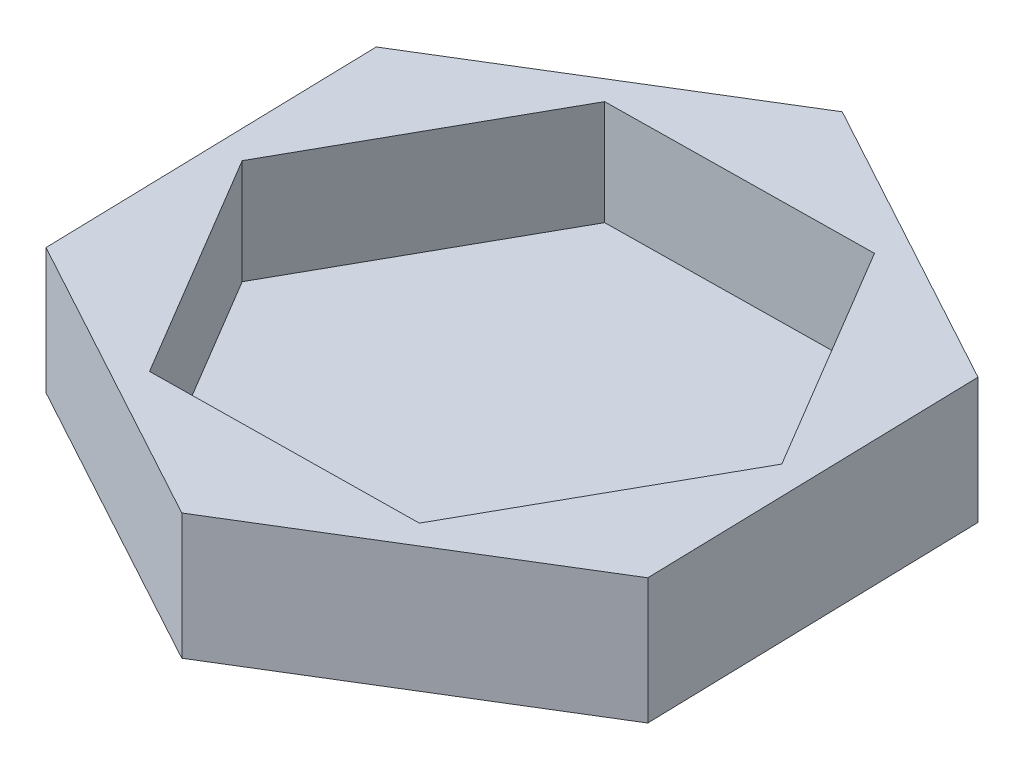
ISO-10303-21;
HEADER;
FILE_DESCRIPTION(('STEP AP214'),'2;1');
FILE_NAME('part.step','',(''),(''),'','','');
FILE_SCHEMA(('AUTOMOTIVE_DESIGN { 1 0 10303 214 1 1 1 1 }'));
ENDSEC;
DATA;
#1=APPLICATION_CONTEXT('core data for automotive mechanical design processes');
#2=APPLICATION_PROTOCOL_DEFINITION('international standard','automotive_design',2000,#1);
#3=PRODUCT_CONTEXT('',#1,'mechanical');
#4=PRODUCT('Part','Part','',(#3));
#5=PRODUCT_RELATED_PRODUCT_CATEGORY('part','',(#4));
#6=PRODUCT_DEFINITION_FORMATION('','',#4);
#7=PRODUCT_DEFINITION_CONTEXT('part definition',#1,'design');
#8=PRODUCT_DEFINITION('design','',#6,#7);
#9=PRODUCT_DEFINITION_SHAPE('','',#8);
#10=(LENGTH_UNIT() NAMED_UNIT(*) SI_UNIT(.MILLI.,.METRE.));
#11=(NAMED_UNIT(*) PLANE_ANGLE_UNIT() SI_UNIT($,.RADIAN.));
#12=(NAMED_UNIT(*) SI_UNIT($,.STERADIAN.) SOLID_ANGLE_UNIT());
#13=UNCERTAINTY_MEASURE_WITH_UNIT(LENGTH_MEASURE(1.E-05),#10,'distance_accuracy_value','');
#14=(GEOMETRIC_REPRESENTATION_CONTEXT(3) GLOBAL_UNCERTAINTY_ASSIGNED_CONTEXT((#13)) GLOBAL_UNIT_ASSIGNED_CONTEXT((#10,
#11,#12)) REPRESENTATION_CONTEXT('',''));
#15=CARTESIAN_POINT('',(0.,0.,0.));
#16=DIRECTION('',(0.,0.,1.));
#17=DIRECTION('',(1.,0.,0.));
#18=AXIS2_PLACEMENT_3D('',#15,#16,#17);
#19=CARTESIAN_POINT('',(-2.05317565383685,30.,-80.8029566480573));
#20=DIRECTION('',(0.521836975991897,0.,0.853045233553082));
#21=DIRECTION('',(0.853045233553082,0.,-0.521836975991897));
#22=AXIS2_PLACEMENT_3D('',#19,#20,#21);
#23=PLANE('',#22);
#24=DIRECTION('',(-0.853045233553082,0.,0.521836975991897));
#25=VECTOR('',#24,1.);
#26=CARTESIAN_POINT('',(-2.05317565383685,0.,-80.8029566480573));
#27=LINE('',#26,#25);
#28=CARTESIAN_POINT('',(-2.05317565383685,0.,-80.8029566480573));
#29=VERTEX_POINT('',#28);
#30=CARTESIAN_POINT('',(-71.0040009850288,0.,-38.6233760493742));
#31=VERTEX_POINT('',#30);
#32=EDGE_CURVE('E146',#29,#31,#27,.T.);
#33=ORIENTED_EDGE('',*,*,#32,.T.);
#34=DIRECTION('',(0.,-1.,0.));
#35=VECTOR('',#34,1.);
#36=CARTESIAN_POINT('',(-71.0040009850288,30.,-38.6233760493742));
#37=LINE('',#36,#35);
#38=CARTESIAN_POINT('',(-71.0040009850288,30.,-38.6233760493742));
#39=VERTEX_POINT('',#38);
#40=EDGE_CURVE('E11',#39,#31,#37,.T.);
#41=ORIENTED_EDGE('',*,*,#40,.F.);
#42=DIRECTION('',(-0.853045233553082,0.,0.521836975991897));
#43=VECTOR('',#42,1.);
#44=CARTESIAN_POINT('',(-2.05317565383685,30.,-80.8029566480573));
#45=LINE('',#44,#43);
#46=CARTESIAN_POINT('',(-2.05317565383685,30.,-80.8029566480573));
#47=VERTEX_POINT('',#46);
#48=EDGE_CURVE('E164',#47,#39,#45,.T.);
#49=ORIENTED_EDGE('',*,*,#48,.F.);
#50=DIRECTION('',(0.,-1.,0.));
#51=VECTOR('',#50,1.);
#52=CARTESIAN_POINT('',(-2.05317565383685,30.,-80.8029566480573));
#53=LINE('',#52,#51);
#54=EDGE_CURVE('E142',#47,#29,#53,.T.);
#55=ORIENTED_EDGE('',*,*,#54,.T.);
#56=EDGE_LOOP('',(#33,#41,#49,#55));
#57=FACE_BOUND('',#56,.T.);
#58=ADVANCED_FACE('F45',(#57),#23,.F.);
#59=CARTESIAN_POINT('',(-71.0040009850288,30.,-38.6233760493742));
#60=DIRECTION('',(0.999677330830147,0.,-0.0254014610664925));
#61=DIRECTION('',(-0.0254014610664925,0.,-0.999677330830147));
#62=AXIS2_PLACEMENT_3D('',#59,#60,#61);
#63=PLANE('',#62);
#64=DIRECTION('',(0.0254014610664925,0.,0.999677330830147));
#65=VECTOR('',#64,1.);
#66=CARTESIAN_POINT('',(-71.0040009850288,0.,-38.6233760493742));
#67=LINE('',#66,#65);
#68=CARTESIAN_POINT('',(-68.9508253311919,0.,42.1795805986831));
#69=VERTEX_POINT('',#68);
#70=EDGE_CURVE('E150',#31,#69,#67,.T.);
#71=ORIENTED_EDGE('',*,*,#70,.T.);
#72=DIRECTION('',(0.,-1.,0.));
#73=VECTOR('',#72,1.);
#74=CARTESIAN_POINT('',(-68.9508253311919,30.,42.1795805986831));
#75=LINE('',#74,#73);
#76=CARTESIAN_POINT('',(-68.9508253311919,30.,42.1795805986831));
#77=VERTEX_POINT('',#76);
#78=EDGE_CURVE('E53',#77,#69,#75,.T.);
#79=ORIENTED_EDGE('',*,*,#78,.F.);
#80=DIRECTION('',(0.0254014610664925,0.,0.999677330830147));
#81=VECTOR('',#80,1.);
#82=CARTESIAN_POINT('',(-71.0040009850288,30.,-38.6233760493742));
#83=LINE('',#82,#81);
#84=EDGE_CURVE('E104',#39,#77,#83,.T.);
#85=ORIENTED_EDGE('',*,*,#84,.F.);
#86=ORIENTED_EDGE('',*,*,#40,.T.);
#87=EDGE_LOOP('',(#71,#79,#85,#86));
#88=FACE_BOUND('',#87,.T.);
#89=ADVANCED_FACE('F311',(#88),#63,.F.);
#90=CARTESIAN_POINT('',(-68.9508253311919,30.,42.1795805986831));
#91=DIRECTION('',(0.47784035483825,0.,-0.878446694619574));
#92=DIRECTION('',(-0.878446694619574,0.,-0.47784035483825));
#93=AXIS2_PLACEMENT_3D('',#90,#91,#92);
#94=PLANE('',#93);
#95=DIRECTION('',(0.878446694619574,0.,0.47784035483825));
#96=VECTOR('',#95,1.);
#97=CARTESIAN_POINT('',(-68.9508253311919,0.,42.1795805986831));
#98=LINE('',#97,#96);
#99=CARTESIAN_POINT('',(2.05317565383684,0.,80.8029566480573));
#100=VERTEX_POINT('',#99);
#101=EDGE_CURVE('E154',#69,#100,#98,.T.);
#102=ORIENTED_EDGE('',*,*,#101,.T.);
#103=DIRECTION('',(0.,-1.,0.));
#104=VECTOR('',#103,1.);
#105=CARTESIAN_POINT('',(2.05317565383684,30.,80.8029566480573));
#106=LINE('',#105,#104);
#107=CARTESIAN_POINT('',(2.05317565383684,30.,80.8029566480573));
#108=VERTEX_POINT('',#107);
#109=EDGE_CURVE('E135',#108,#100,#106,.T.);
#110=ORIENTED_EDGE('',*,*,#109,.F.);
#111=DIRECTION('',(0.878446694619574,0.,0.47784035483825));
#112=VECTOR('',#111,1.);
#113=CARTESIAN_POINT('',(-68.9508253311919,30.,42.1795805986831));
#114=LINE('',#113,#112);
#115=EDGE_CURVE('E121',#77,#108,#114,.T.);
#116=ORIENTED_EDGE('',*,*,#115,.F.);
#117=ORIENTED_EDGE('',*,*,#78,.T.);
#118=EDGE_LOOP('',(#102,#110,#116,#117));
#119=FACE_BOUND('',#118,.T.);
#120=ADVANCED_FACE('F174',(#119),#94,.F.);
#121=CARTESIAN_POINT('',(2.05317565383684,30.,80.8029566480573));
#122=DIRECTION('',(-0.521836975991898,0.,-0.853045233553082));
#123=DIRECTION('',(-0.853045233553082,0.,0.521836975991898));
#124=AXIS2_PLACEMENT_3D('',#121,#122,#123);
#125=PLANE('',#124);
#126=DIRECTION('',(0.853045233553082,0.,-0.521836975991898));
#127=VECTOR('',#126,1.);
#128=CARTESIAN_POINT('',(2.05317565383684,0.,80.8029566480573));
#129=LINE('',#128,#127);
#130=CARTESIAN_POINT('',(71.0040009850287,0.,38.6233760493741));
#131=VERTEX_POINT('',#130);
#132=EDGE_CURVE('E131',#100,#131,#129,.T.);
#133=ORIENTED_EDGE('',*,*,#132,.T.);
#134=DIRECTION('',(0.,-1.,0.));
#135=VECTOR('',#134,1.);
#136=CARTESIAN_POINT('',(71.0040009850287,30.,38.6233760493741));
#137=LINE('',#136,#135);
#138=CARTESIAN_POINT('',(71.0040009850287,30.,38.6233760493741));
#139=VERTEX_POINT('',#138);
#140=EDGE_CURVE('E128',#139,#131,#137,.T.);
#141=ORIENTED_EDGE('',*,*,#140,.F.);
#142=DIRECTION('',(0.853045233553082,0.,-0.521836975991898));
#143=VECTOR('',#142,1.);
#144=CARTESIAN_POINT('',(2.05317565383684,30.,80.8029566480573));
#145=LINE('',#144,#143);
#146=EDGE_CURVE('E114',#108,#139,#145,.T.);
#147=ORIENTED_EDGE('',*,*,#146,.F.);
#148=ORIENTED_EDGE('',*,*,#109,.T.);
#149=EDGE_LOOP('',(#133,#141,#147,#148));
#150=FACE_BOUND('',#149,.T.);
#151=ADVANCED_FACE('F129',(#150),#125,.F.);
#152=CARTESIAN_POINT('',(71.0040009850287,30.,38.6233760493741));
#153=DIRECTION('',(-0.999677330830147,0.,0.0254014610664925));
#154=DIRECTION('',(0.0254014610664925,0.,0.999677330830147));
#155=AXIS2_PLACEMENT_3D('',#152,#153,#154);
#156=PLANE('',#155);
#157=DIRECTION('',(-0.0254014610664925,0.,-0.999677330830147));
#158=VECTOR('',#157,1.);
#159=CARTESIAN_POINT('',(71.0040009850287,0.,38.6233760493741));
#160=LINE('',#159,#158);
#161=CARTESIAN_POINT('',(68.9508253311918,0.,-42.1795805986832));
#162=VERTEX_POINT('',#161);
#163=EDGE_CURVE('E159',#131,#162,#160,.T.);
#164=ORIENTED_EDGE('',*,*,#163,.T.);
#165=DIRECTION('',(0.,-1.,0.));
#166=VECTOR('',#165,1.);
#167=CARTESIAN_POINT('',(68.9508253311918,30.,-42.1795805986832));
#168=LINE('',#167,#166);
#169=CARTESIAN_POINT('',(68.9508253311918,30.,-42.1795805986832));
#170=VERTEX_POINT('',#169);
#171=EDGE_CURVE('E136',#170,#162,#168,.T.);
#172=ORIENTED_EDGE('',*,*,#171,.F.);
#173=DIRECTION('',(-0.0254014610664925,0.,-0.999677330830147));
#174=VECTOR('',#173,1.);
#175=CARTESIAN_POINT('',(71.0040009850287,30.,38.6233760493741));
#176=LINE('',#175,#174);
#177=EDGE_CURVE('E118',#139,#170,#176,.T.);
#178=ORIENTED_EDGE('',*,*,#177,.F.);
#179=ORIENTED_EDGE('',*,*,#140,.T.);
#180=EDGE_LOOP('',(#164,#172,#178,#179));
#181=FACE_BOUND('',#180,.T.);
#182=ADVANCED_FACE('F138',(#181),#156,.F.);
#183=CARTESIAN_POINT('',(68.9508253311918,30.,-42.1795805986832));
#184=DIRECTION('',(-0.47784035483825,0.,0.878446694619574));
#185=DIRECTION('',(0.878446694619574,0.,0.47784035483825));
#186=AXIS2_PLACEMENT_3D('',#183,#184,#185);
#187=PLANE('',#186);
#188=DIRECTION('',(-0.878446694619574,0.,-0.47784035483825));
#189=VECTOR('',#188,1.);
#190=CARTESIAN_POINT('',(68.9508253311918,0.,-42.1795805986832));
#191=LINE('',#190,#189);
#192=EDGE_CURVE('E96',#162,#29,#191,.T.);
#193=ORIENTED_EDGE('',*,*,#192,.T.);
#194=ORIENTED_EDGE('',*,*,#54,.F.);
#195=DIRECTION('',(-0.878446694619574,0.,-0.47784035483825));
#196=VECTOR('',#195,1.);
#197=CARTESIAN_POINT('',(68.9508253311918,30.,-42.1795805986832));
#198=LINE('',#197,#196);
#199=EDGE_CURVE('E69',#170,#47,#198,.T.);
#200=ORIENTED_EDGE('',*,*,#199,.F.);
#201=ORIENTED_EDGE('',*,*,#171,.T.);
#202=EDGE_LOOP('',(#193,#194,#200,#201));
#203=FACE_BOUND('',#202,.T.);
#204=ADVANCED_FACE('F178',(#203),#187,.F.);
#205=CARTESIAN_POINT('',(0.,30.,0.));
#206=DIRECTION('',(0.,1.,0.));
#207=DIRECTION('',(0.,0.,1.));
#208=AXIS2_PLACEMENT_3D('',#205,#206,#207);
#209=PLANE('',#208);
#210=DIRECTION('',(-0.999912596267652,0.,0.0132211884973553));
#211=VECTOR('',#210,1.);
#212=CARTESIAN_POINT('',(31.0243239968129,30.,-55.4150219153084));
#213=LINE('',#212,#211);
#214=CARTESIAN_POINT('',(31.0243239968129,30.,-55.4150219153084));
#215=VERTEX_POINT('',#214);
#216=CARTESIAN_POINT('',(-32.478654731522,30.,-54.5753636741334));
#217=VERTEX_POINT('',#216);
#218=EDGE_CURVE('E60',#215,#217,#213,.T.);
#219=ORIENTED_EDGE('',*,*,#218,.F.);
#220=DIRECTION('',(-0.511406183240759,0.,-0.859339115683162));
#221=VECTOR('',#220,1.);
#222=CARTESIAN_POINT('',(63.502978728335,30.,-0.839658241175054));
#223=LINE('',#222,#221);
#224=CARTESIAN_POINT('',(63.502978728335,30.,-0.839658241175054));
#225=VERTEX_POINT('',#224);
#226=EDGE_CURVE('E210',#225,#215,#223,.T.);
#227=ORIENTED_EDGE('',*,*,#226,.F.);
#228=DIRECTION('',(0.488506413026894,0.,-0.872560304180518));
#229=VECTOR('',#228,1.);
#230=CARTESIAN_POINT('',(32.478654731522,30.,54.5753636741334));
#231=LINE('',#230,#229);
#232=CARTESIAN_POINT('',(32.478654731522,30.,54.5753636741334));
#233=VERTEX_POINT('',#232);
#234=EDGE_CURVE('E215',#233,#225,#231,.T.);
#235=ORIENTED_EDGE('',*,*,#234,.F.);
#236=DIRECTION('',(0.999912596267652,0.,-0.0132211884973553));
#237=VECTOR('',#236,1.);
#238=CARTESIAN_POINT('',(-31.0243239968129,30.,55.4150219153084));
#239=LINE('',#238,#237);
#240=CARTESIAN_POINT('',(-31.0243239968129,30.,55.4150219153084));
#241=VERTEX_POINT('',#240);
#242=EDGE_CURVE('E219',#241,#233,#239,.T.);
#243=ORIENTED_EDGE('',*,*,#242,.F.);
#244=DIRECTION('',(0.511406183240759,0.,0.859339115683162));
#245=VECTOR('',#244,1.);
#246=CARTESIAN_POINT('',(-63.5029787283349,30.,0.839658241175057));
#247=LINE('',#246,#245);
#248=CARTESIAN_POINT('',(-63.5029787283349,30.,0.839658241175057));
#249=VERTEX_POINT('',#248);
#250=EDGE_CURVE('E223',#249,#241,#247,.T.);
#251=ORIENTED_EDGE('',*,*,#250,.F.);
#252=DIRECTION('',(-0.488506413026894,0.,0.872560304180518));
#253=VECTOR('',#252,1.);
#254=CARTESIAN_POINT('',(-32.478654731522,30.,-54.5753636741334));
#255=LINE('',#254,#253);
#256=EDGE_CURVE('E227',#217,#249,#255,.T.);
#257=ORIENTED_EDGE('',*,*,#256,.F.);
#258=EDGE_LOOP('',(#219,#227,#235,#243,#251,#257));
#259=FACE_BOUND('',#258,.T.);
#260=ORIENTED_EDGE('',*,*,#48,.T.);
#261=ORIENTED_EDGE('',*,*,#84,.T.);
#262=ORIENTED_EDGE('',*,*,#115,.T.);
#263=ORIENTED_EDGE('',*,*,#146,.T.);
#264=ORIENTED_EDGE('',*,*,#177,.T.);
#265=ORIENTED_EDGE('',*,*,#199,.T.);
#266=EDGE_LOOP('',(#260,#261,#262,#263,#264,#265));
#267=FACE_BOUND('',#266,.T.);
#268=ADVANCED_FACE('F116',(#259,#267),#209,.T.);
#269=CARTESIAN_POINT('',(0.,0.,0.));
#270=DIRECTION('',(0.,1.,0.));
#271=DIRECTION('',(0.,0.,1.));
#272=AXIS2_PLACEMENT_3D('',#269,#270,#271);
#273=PLANE('',#272);
#274=ORIENTED_EDGE('',*,*,#32,.F.);
#275=ORIENTED_EDGE('',*,*,#192,.F.);
#276=ORIENTED_EDGE('',*,*,#163,.F.);
#277=ORIENTED_EDGE('',*,*,#132,.F.);
#278=ORIENTED_EDGE('',*,*,#101,.F.);
#279=ORIENTED_EDGE('',*,*,#70,.F.);
#280=EDGE_LOOP('',(#274,#275,#276,#277,#278,#279));
#281=FACE_BOUND('',#280,.T.);
#282=ADVANCED_FACE('F177',(#281),#273,.F.);
#283=CARTESIAN_POINT('',(31.0243239968129,5.,-55.4150219153084));
#284=DIRECTION('',(-0.0132211884973553,0.,-0.999912596267652));
#285=DIRECTION('',(-0.999912596267652,0.,0.0132211884973553));
#286=AXIS2_PLACEMENT_3D('',#283,#284,#285);
#287=PLANE('',#286);
#288=ORIENTED_EDGE('',*,*,#218,.T.);
#289=DIRECTION('',(0.,1.,0.));
#290=VECTOR('',#289,1.);
#291=CARTESIAN_POINT('',(-32.478654731522,5.,-54.5753636741334));
#292=LINE('',#291,#290);
#293=CARTESIAN_POINT('',(-32.478654731522,5.,-54.5753636741334));
#294=VERTEX_POINT('',#293);
#295=EDGE_CURVE('E187',#294,#217,#292,.T.);
#296=ORIENTED_EDGE('',*,*,#295,.F.);
#297=DIRECTION('',(-0.999912596267652,0.,0.0132211884973553));
#298=VECTOR('',#297,1.);
#299=CARTESIAN_POINT('',(31.0243239968129,5.,-55.4150219153084));
#300=LINE('',#299,#298);
#301=CARTESIAN_POINT('',(31.0243239968129,5.,-55.4150219153084));
#302=VERTEX_POINT('',#301);
#303=EDGE_CURVE('E214',#302,#294,#300,.T.);
#304=ORIENTED_EDGE('',*,*,#303,.F.);
#305=DIRECTION('',(0.,1.,0.));
#306=VECTOR('',#305,1.);
#307=CARTESIAN_POINT('',(31.0243239968129,5.,-55.4150219153084));
#308=LINE('',#307,#306);
#309=EDGE_CURVE('E151',#302,#215,#308,.T.);
#310=ORIENTED_EDGE('',*,*,#309,.T.);
#311=EDGE_LOOP('',(#288,#296,#304,#310));
#312=FACE_BOUND('',#311,.T.);
#313=ADVANCED_FACE('F262',(#312),#287,.F.);
#314=CARTESIAN_POINT('',(63.502978728335,5.,-0.839658241175054));
#315=DIRECTION('',(0.859339115683162,0.,-0.511406183240759));
#316=DIRECTION('',(-0.511406183240759,0.,-0.859339115683162));
#317=AXIS2_PLACEMENT_3D('',#314,#315,#316);
#318=PLANE('',#317);
#319=ORIENTED_EDGE('',*,*,#226,.T.);
#320=ORIENTED_EDGE('',*,*,#309,.F.);
#321=DIRECTION('',(-0.511406183240759,0.,-0.859339115683162));
#322=VECTOR('',#321,1.);
#323=CARTESIAN_POINT('',(63.502978728335,5.,-0.839658241175054));
#324=LINE('',#323,#322);
#325=CARTESIAN_POINT('',(63.502978728335,5.,-0.839658241175054));
#326=VERTEX_POINT('',#325);
#327=EDGE_CURVE('E192',#326,#302,#324,.T.);
#328=ORIENTED_EDGE('',*,*,#327,.F.);
#329=DIRECTION('',(0.,1.,0.));
#330=VECTOR('',#329,1.);
#331=CARTESIAN_POINT('',(63.502978728335,5.,-0.839658241175054));
#332=LINE('',#331,#330);
#333=EDGE_CURVE('E204',#326,#225,#332,.T.);
#334=ORIENTED_EDGE('',*,*,#333,.T.);
#335=EDGE_LOOP('',(#319,#320,#328,#334));
#336=FACE_BOUND('',#335,.T.);
#337=ADVANCED_FACE('F278',(#336),#318,.F.);
#338=CARTESIAN_POINT('',(32.478654731522,5.,54.5753636741334));
#339=DIRECTION('',(0.872560304180518,0.,0.488506413026893));
#340=DIRECTION('',(0.488506413026894,0.,-0.872560304180518));
#341=AXIS2_PLACEMENT_3D('',#338,#339,#340);
#342=PLANE('',#341);
#343=ORIENTED_EDGE('',*,*,#234,.T.);
#344=ORIENTED_EDGE('',*,*,#333,.F.);
#345=DIRECTION('',(0.488506413026894,0.,-0.872560304180518));
#346=VECTOR('',#345,1.);
#347=CARTESIAN_POINT('',(32.478654731522,5.,54.5753636741334));
#348=LINE('',#347,#346);
#349=CARTESIAN_POINT('',(32.478654731522,5.,54.5753636741334));
#350=VERTEX_POINT('',#349);
#351=EDGE_CURVE('E236',#350,#326,#348,.T.);
#352=ORIENTED_EDGE('',*,*,#351,.F.);
#353=DIRECTION('',(0.,1.,0.));
#354=VECTOR('',#353,1.);
#355=CARTESIAN_POINT('',(32.478654731522,5.,54.5753636741334));
#356=LINE('',#355,#354);
#357=EDGE_CURVE('E200',#350,#233,#356,.T.);
#358=ORIENTED_EDGE('',*,*,#357,.T.);
#359=EDGE_LOOP('',(#343,#344,#352,#358));
#360=FACE_BOUND('',#359,.T.);
#361=ADVANCED_FACE('F283',(#360),#342,.F.);
#362=CARTESIAN_POINT('',(-31.0243239968129,5.,55.4150219153084));
#363=DIRECTION('',(0.0132211884973553,0.,0.999912596267652));
#364=DIRECTION('',(0.999912596267652,0.,-0.0132211884973553));
#365=AXIS2_PLACEMENT_3D('',#362,#363,#364);
#366=PLANE('',#365);
#367=ORIENTED_EDGE('',*,*,#242,.T.);
#368=ORIENTED_EDGE('',*,*,#357,.F.);
#369=DIRECTION('',(0.999912596267652,0.,-0.0132211884973553));
#370=VECTOR('',#369,1.);
#371=CARTESIAN_POINT('',(-31.0243239968129,5.,55.4150219153084));
#372=LINE('',#371,#370);
#373=CARTESIAN_POINT('',(-31.0243239968129,5.,55.4150219153084));
#374=VERTEX_POINT('',#373);
#375=EDGE_CURVE('E240',#374,#350,#372,.T.);
#376=ORIENTED_EDGE('',*,*,#375,.F.);
#377=DIRECTION('',(0.,1.,0.));
#378=VECTOR('',#377,1.);
#379=CARTESIAN_POINT('',(-31.0243239968129,5.,55.4150219153084));
#380=LINE('',#379,#378);
#381=EDGE_CURVE('E196',#374,#241,#380,.T.);
#382=ORIENTED_EDGE('',*,*,#381,.T.);
#383=EDGE_LOOP('',(#367,#368,#376,#382));
#384=FACE_BOUND('',#383,.T.);
#385=ADVANCED_FACE('F301',(#384),#366,.F.);
#386=CARTESIAN_POINT('',(-63.5029787283349,5.,0.839658241175057));
#387=DIRECTION('',(-0.859339115683162,0.,0.511406183240759));
#388=DIRECTION('',(0.511406183240759,0.,0.859339115683162));
#389=AXIS2_PLACEMENT_3D('',#386,#387,#388);
#390=PLANE('',#389);
#391=ORIENTED_EDGE('',*,*,#250,.T.);
#392=ORIENTED_EDGE('',*,*,#381,.F.);
#393=DIRECTION('',(0.511406183240759,0.,0.859339115683162));
#394=VECTOR('',#393,1.);
#395=CARTESIAN_POINT('',(-63.5029787283349,5.,0.839658241175057));
#396=LINE('',#395,#394);
#397=CARTESIAN_POINT('',(-63.5029787283349,5.,0.839658241175057));
#398=VERTEX_POINT('',#397);
#399=EDGE_CURVE('E244',#398,#374,#396,.T.);
#400=ORIENTED_EDGE('',*,*,#399,.F.);
#401=DIRECTION('',(0.,1.,0.));
#402=VECTOR('',#401,1.);
#403=CARTESIAN_POINT('',(-63.5029787283349,5.,0.839658241175057));
#404=LINE('',#403,#402);
#405=EDGE_CURVE('E191',#398,#249,#404,.T.);
#406=ORIENTED_EDGE('',*,*,#405,.T.);
#407=EDGE_LOOP('',(#391,#392,#400,#406));
#408=FACE_BOUND('',#407,.T.);
#409=ADVANCED_FACE('F297',(#408),#390,.F.);
#410=CARTESIAN_POINT('',(-32.478654731522,5.,-54.5753636741334));
#411=DIRECTION('',(-0.872560304180518,0.,-0.488506413026894));
#412=DIRECTION('',(-0.488506413026894,0.,0.872560304180518));
#413=AXIS2_PLACEMENT_3D('',#410,#411,#412);
#414=PLANE('',#413);
#415=ORIENTED_EDGE('',*,*,#256,.T.);
#416=ORIENTED_EDGE('',*,*,#405,.F.);
#417=DIRECTION('',(-0.488506413026894,0.,0.872560304180518));
#418=VECTOR('',#417,1.);
#419=CARTESIAN_POINT('',(-32.478654731522,5.,-54.5753636741334));
#420=LINE('',#419,#418);
#421=EDGE_CURVE('E248',#294,#398,#420,.T.);
#422=ORIENTED_EDGE('',*,*,#421,.F.);
#423=ORIENTED_EDGE('',*,*,#295,.T.);
#424=EDGE_LOOP('',(#415,#416,#422,#423));
#425=FACE_BOUND('',#424,.T.);
#426=ADVANCED_FACE('F291',(#425),#414,.F.);
#427=CARTESIAN_POINT('',(0.,5.,0.));
#428=DIRECTION('',(0.,1.,0.));
#429=DIRECTION('',(0.,0.,1.));
#430=AXIS2_PLACEMENT_3D('',#427,#428,#429);
#431=PLANE('',#430);
#432=ORIENTED_EDGE('',*,*,#303,.T.);
#433=ORIENTED_EDGE('',*,*,#421,.T.);
#434=ORIENTED_EDGE('',*,*,#399,.T.);
#435=ORIENTED_EDGE('',*,*,#375,.T.);
#436=ORIENTED_EDGE('',*,*,#351,.T.);
#437=ORIENTED_EDGE('',*,*,#327,.T.);
#438=EDGE_LOOP('',(#432,#433,#434,#435,#436,#437));
#439=FACE_BOUND('',#438,.T.);
#440=ADVANCED_FACE('F257',(#439),#431,.T.);
#441=CLOSED_SHELL('',(#58,#89,#120,#151,#182,#204,#268,#282,#313,#337,#361,#385,#409,#426,#440));
#442=MANIFOLD_SOLID_BREP('B2',#441);
#443=ADVANCED_BREP_SHAPE_REPRESENTATION('',(#18,#442),#14);
#444=SHAPE_DEFINITION_REPRESENTATION(#9,#443);
ENDSEC;
END-ISO-10303-21;
